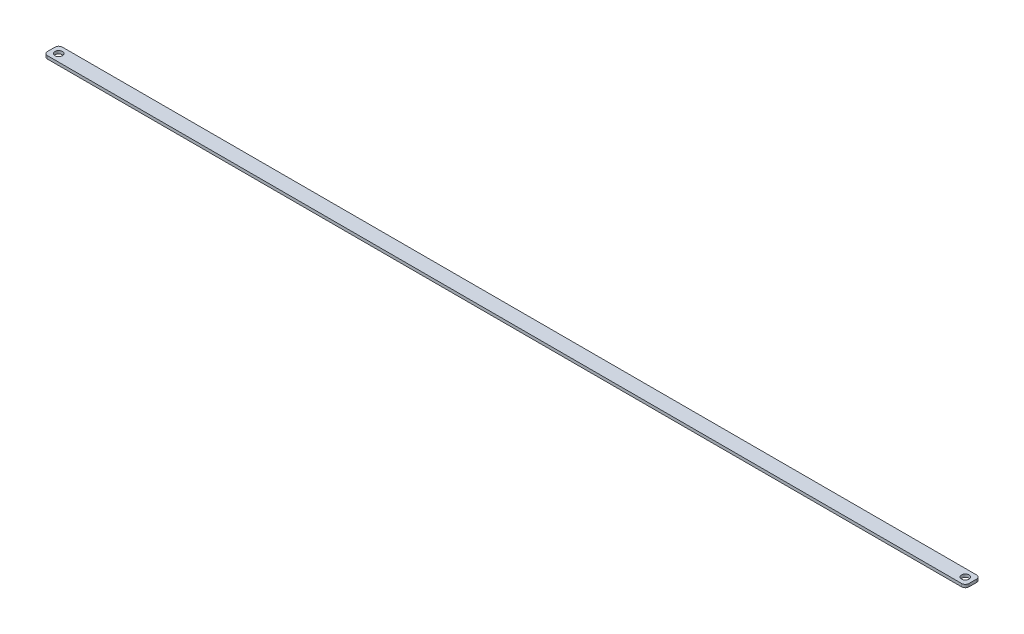
ISO-10303-21;
HEADER;
FILE_DESCRIPTION(('STEP AP214'),'2;1');
FILE_NAME('part.step','',(''),(''),'','','');
FILE_SCHEMA(('AUTOMOTIVE_DESIGN { 1 0 10303 214 1 1 1 1 }'));
ENDSEC;
DATA;
#1=APPLICATION_CONTEXT('core data for automotive mechanical design processes');
#2=APPLICATION_PROTOCOL_DEFINITION('international standard','automotive_design',2000,#1);
#3=PRODUCT_CONTEXT('',#1,'mechanical');
#4=PRODUCT('Part','Part','',(#3));
#5=PRODUCT_RELATED_PRODUCT_CATEGORY('part','',(#4));
#6=PRODUCT_DEFINITION_FORMATION('','',#4);
#7=PRODUCT_DEFINITION_CONTEXT('part definition',#1,'design');
#8=PRODUCT_DEFINITION('design','',#6,#7);
#9=PRODUCT_DEFINITION_SHAPE('','',#8);
#10=(LENGTH_UNIT() NAMED_UNIT(*) SI_UNIT(.MILLI.,.METRE.));
#11=(NAMED_UNIT(*) PLANE_ANGLE_UNIT() SI_UNIT($,.RADIAN.));
#12=(NAMED_UNIT(*) SI_UNIT($,.STERADIAN.) SOLID_ANGLE_UNIT());
#13=UNCERTAINTY_MEASURE_WITH_UNIT(LENGTH_MEASURE(1.E-05),#10,'distance_accuracy_value','');
#14=(GEOMETRIC_REPRESENTATION_CONTEXT(3) GLOBAL_UNCERTAINTY_ASSIGNED_CONTEXT((#13)) GLOBAL_UNIT_ASSIGNED_CONTEXT((#10,
#11,#12)) REPRESENTATION_CONTEXT('',''));
#15=CARTESIAN_POINT('',(0.,0.,0.));
#16=DIRECTION('',(0.,0.,1.));
#17=DIRECTION('',(1.,0.,0.));
#18=AXIS2_PLACEMENT_3D('',#15,#16,#17);
#19=CARTESIAN_POINT('',(336.370614307122,2.,-5.));
#20=DIRECTION('',(0.,-1.,0.));
#21=DIRECTION('',(0.,0.,-1.));
#22=AXIS2_PLACEMENT_3D('',#19,#20,#21);
#23=CYLINDRICAL_SURFACE('',#22,2.5);
#24=CARTESIAN_POINT('',(336.370614307122,0.,-5.));
#25=DIRECTION('',(0.,1.,0.));
#26=DIRECTION('',(0.,0.,1.));
#27=AXIS2_PLACEMENT_3D('',#24,#25,#26);
#28=CIRCLE('',#27,2.5);
#29=CARTESIAN_POINT('',(336.370614307122,0.,-2.5));
#30=VERTEX_POINT('',#29);
#31=EDGE_CURVE('E220',#30,#30,#28,.T.);
#32=ORIENTED_EDGE('',*,*,#31,.F.);
#33=EDGE_LOOP('',(#32));
#34=FACE_BOUND('',#33,.T.);
#35=CARTESIAN_POINT('',(336.370614307122,2.,-5.));
#36=DIRECTION('',(0.,1.,0.));
#37=DIRECTION('',(0.,0.,1.));
#38=AXIS2_PLACEMENT_3D('',#35,#36,#37);
#39=CIRCLE('',#38,2.5);
#40=CARTESIAN_POINT('',(336.370614307122,2.,-2.5));
#41=VERTEX_POINT('',#40);
#42=EDGE_CURVE('E13',#41,#41,#39,.T.);
#43=ORIENTED_EDGE('',*,*,#42,.T.);
#44=EDGE_LOOP('',(#43));
#45=FACE_BOUND('',#44,.T.);
#46=ADVANCED_FACE('F93',(#34,#45),#23,.F.);
#47=CARTESIAN_POINT('',(-272.629385692878,2.,-5.));
#48=DIRECTION('',(0.,-1.,0.));
#49=DIRECTION('',(0.,0.,-1.));
#50=AXIS2_PLACEMENT_3D('',#47,#48,#49);
#51=CYLINDRICAL_SURFACE('',#50,2.5);
#52=CARTESIAN_POINT('',(-272.629385692878,0.,-5.));
#53=DIRECTION('',(0.,1.,0.));
#54=DIRECTION('',(0.,0.,1.));
#55=AXIS2_PLACEMENT_3D('',#52,#53,#54);
#56=CIRCLE('',#55,2.5);
#57=CARTESIAN_POINT('',(-272.629385692878,0.,-2.5));
#58=VERTEX_POINT('',#57);
#59=EDGE_CURVE('E233',#58,#58,#56,.T.);
#60=ORIENTED_EDGE('',*,*,#59,.F.);
#61=EDGE_LOOP('',(#60));
#62=FACE_BOUND('',#61,.T.);
#63=CARTESIAN_POINT('',(-272.629385692878,2.,-5.));
#64=DIRECTION('',(0.,1.,0.));
#65=DIRECTION('',(0.,0.,1.));
#66=AXIS2_PLACEMENT_3D('',#63,#64,#65);
#67=CIRCLE('',#66,2.5);
#68=CARTESIAN_POINT('',(-272.629385692878,2.,-2.5));
#69=VERTEX_POINT('',#68);
#70=EDGE_CURVE('E103',#69,#69,#67,.T.);
#71=ORIENTED_EDGE('',*,*,#70,.T.);
#72=EDGE_LOOP('',(#71));
#73=FACE_BOUND('',#72,.T.);
#74=ADVANCED_FACE('F254',(#62,#73),#51,.F.);
#75=CARTESIAN_POINT('',(47.5,2.,-2.5));
#76=DIRECTION('',(0.,1.,0.));
#77=DIRECTION('',(0.,0.,1.));
#78=AXIS2_PLACEMENT_3D('',#75,#76,#77);
#79=PLANE('',#78);
#80=DIRECTION('',(1.,0.,0.));
#81=VECTOR('',#80,1.);
#82=CARTESIAN_POINT('',(-275.129385692878,2.,0.));
#83=LINE('',#82,#81);
#84=CARTESIAN_POINT('',(-275.129385692878,2.,0.));
#85=VERTEX_POINT('',#84);
#86=CARTESIAN_POINT('',(338.870614307122,2.,0.));
#87=VERTEX_POINT('',#86);
#88=EDGE_CURVE('E156',#85,#87,#83,.T.);
#89=ORIENTED_EDGE('',*,*,#88,.T.);
#90=CARTESIAN_POINT('',(338.870614307122,2.,-2.5));
#91=DIRECTION('',(0.,1.,0.));
#92=DIRECTION('',(0.,0.,1.));
#93=AXIS2_PLACEMENT_3D('',#90,#91,#92);
#94=CIRCLE('',#93,2.5);
#95=CARTESIAN_POINT('',(341.370614307122,2.,-2.50000000000002));
#96=VERTEX_POINT('',#95);
#97=EDGE_CURVE('E162',#87,#96,#94,.T.);
#98=ORIENTED_EDGE('',*,*,#97,.T.);
#99=DIRECTION('',(0.,0.,-1.));
#100=VECTOR('',#99,1.);
#101=CARTESIAN_POINT('',(341.370614307122,2.,-2.50000000000002));
#102=LINE('',#101,#100);
#103=CARTESIAN_POINT('',(341.370614307122,2.,-7.49999999999998));
#104=VERTEX_POINT('',#103);
#105=EDGE_CURVE('E184',#96,#104,#102,.T.);
#106=ORIENTED_EDGE('',*,*,#105,.T.);
#107=CARTESIAN_POINT('',(338.870614307122,2.,-7.5));
#108=DIRECTION('',(0.,1.,0.));
#109=DIRECTION('',(0.,0.,-1.));
#110=AXIS2_PLACEMENT_3D('',#107,#108,#109);
#111=CIRCLE('',#110,2.5);
#112=CARTESIAN_POINT('',(338.870614307122,2.,-10.));
#113=VERTEX_POINT('',#112);
#114=EDGE_CURVE('E188',#104,#113,#111,.T.);
#115=ORIENTED_EDGE('',*,*,#114,.T.);
#116=DIRECTION('',(-1.,0.,0.));
#117=VECTOR('',#116,1.);
#118=CARTESIAN_POINT('',(293.870614307122,2.,-10.));
#119=LINE('',#118,#117);
#120=CARTESIAN_POINT('',(-275.129385692878,2.,-10.));
#121=VERTEX_POINT('',#120);
#122=EDGE_CURVE('E242',#113,#121,#119,.T.);
#123=ORIENTED_EDGE('',*,*,#122,.T.);
#124=CARTESIAN_POINT('',(-275.129385692878,2.,-7.5));
#125=DIRECTION('',(0.,1.,0.));
#126=DIRECTION('',(0.,0.,-1.));
#127=AXIS2_PLACEMENT_3D('',#124,#125,#126);
#128=CIRCLE('',#127,2.5);
#129=CARTESIAN_POINT('',(-277.629385692878,2.,-7.49999999999998));
#130=VERTEX_POINT('',#129);
#131=EDGE_CURVE('E168',#121,#130,#128,.T.);
#132=ORIENTED_EDGE('',*,*,#131,.T.);
#133=DIRECTION('',(0.,0.,1.));
#134=VECTOR('',#133,1.);
#135=CARTESIAN_POINT('',(-277.629385692878,2.,-2.50000000000002));
#136=LINE('',#135,#134);
#137=CARTESIAN_POINT('',(-277.629385692878,2.,-2.50000000000002));
#138=VERTEX_POINT('',#137);
#139=EDGE_CURVE('E186',#130,#138,#136,.T.);
#140=ORIENTED_EDGE('',*,*,#139,.T.);
#141=CARTESIAN_POINT('',(-275.129385692878,2.,-2.5));
#142=DIRECTION('',(0.,1.,0.));
#143=DIRECTION('',(0.,0.,-1.));
#144=AXIS2_PLACEMENT_3D('',#141,#142,#143);
#145=CIRCLE('',#144,2.5);
#146=EDGE_CURVE('E165',#138,#85,#145,.T.);
#147=ORIENTED_EDGE('',*,*,#146,.T.);
#148=EDGE_LOOP('',(#89,#98,#106,#115,#123,#132,#140,#147));
#149=FACE_BOUND('',#148,.T.);
#150=ORIENTED_EDGE('',*,*,#42,.F.);
#151=EDGE_LOOP('',(#150));
#152=FACE_BOUND('',#151,.T.);
#153=ORIENTED_EDGE('',*,*,#70,.F.);
#154=EDGE_LOOP('',(#153));
#155=FACE_BOUND('',#154,.T.);
#156=ADVANCED_FACE('F158',(#149,#152,#155),#79,.T.);
#157=CARTESIAN_POINT('',(338.870614307122,0.,-2.5));
#158=DIRECTION('',(0.,1.,0.));
#159=DIRECTION('',(0.,0.,1.));
#160=AXIS2_PLACEMENT_3D('',#157,#158,#159);
#161=PLANE('',#160);
#162=ORIENTED_EDGE('',*,*,#31,.T.);
#163=EDGE_LOOP('',(#162));
#164=FACE_BOUND('',#163,.T.);
#165=CARTESIAN_POINT('',(338.870614307122,0.,-2.5));
#166=DIRECTION('',(0.,1.,0.));
#167=DIRECTION('',(0.,0.,1.));
#168=AXIS2_PLACEMENT_3D('',#165,#166,#167);
#169=CIRCLE('',#168,2.5);
#170=CARTESIAN_POINT('',(338.870614307122,0.,0.));
#171=VERTEX_POINT('',#170);
#172=CARTESIAN_POINT('',(341.370614307122,0.,-2.50000000000002));
#173=VERTEX_POINT('',#172);
#174=EDGE_CURVE('E177',#171,#173,#169,.T.);
#175=ORIENTED_EDGE('',*,*,#174,.F.);
#176=DIRECTION('',(1.,0.,0.));
#177=VECTOR('',#176,1.);
#178=CARTESIAN_POINT('',(-275.129385692878,0.,0.));
#179=LINE('',#178,#177);
#180=CARTESIAN_POINT('',(-275.129385692878,0.,0.));
#181=VERTEX_POINT('',#180);
#182=EDGE_CURVE('E173',#181,#171,#179,.T.);
#183=ORIENTED_EDGE('',*,*,#182,.F.);
#184=CARTESIAN_POINT('',(-275.129385692878,0.,-2.5));
#185=DIRECTION('',(0.,1.,0.));
#186=DIRECTION('',(0.,0.,-1.));
#187=AXIS2_PLACEMENT_3D('',#184,#185,#186);
#188=CIRCLE('',#187,2.5);
#189=CARTESIAN_POINT('',(-277.629385692878,0.,-2.50000000000002));
#190=VERTEX_POINT('',#189);
#191=EDGE_CURVE('E199',#190,#181,#188,.T.);
#192=ORIENTED_EDGE('',*,*,#191,.F.);
#193=DIRECTION('',(0.,0.,1.));
#194=VECTOR('',#193,1.);
#195=CARTESIAN_POINT('',(-277.629385692878,0.,-2.50000000000002));
#196=LINE('',#195,#194);
#197=CARTESIAN_POINT('',(-277.629385692878,0.,-7.49999999999998));
#198=VERTEX_POINT('',#197);
#199=EDGE_CURVE('E206',#198,#190,#196,.T.);
#200=ORIENTED_EDGE('',*,*,#199,.F.);
#201=CARTESIAN_POINT('',(-275.129385692878,0.,-7.5));
#202=DIRECTION('',(0.,1.,0.));
#203=DIRECTION('',(0.,0.,-1.));
#204=AXIS2_PLACEMENT_3D('',#201,#202,#203);
#205=CIRCLE('',#204,2.5);
#206=CARTESIAN_POINT('',(-275.129385692878,0.,-10.));
#207=VERTEX_POINT('',#206);
#208=EDGE_CURVE('E212',#207,#198,#205,.T.);
#209=ORIENTED_EDGE('',*,*,#208,.F.);
#210=DIRECTION('',(-1.,0.,0.));
#211=VECTOR('',#210,1.);
#212=CARTESIAN_POINT('',(293.870614307122,0.,-10.));
#213=LINE('',#212,#211);
#214=CARTESIAN_POINT('',(338.870614307122,0.,-10.));
#215=VERTEX_POINT('',#214);
#216=EDGE_CURVE('E218',#215,#207,#213,.T.);
#217=ORIENTED_EDGE('',*,*,#216,.F.);
#218=CARTESIAN_POINT('',(338.870614307122,0.,-7.5));
#219=DIRECTION('',(0.,1.,0.));
#220=DIRECTION('',(0.,0.,-1.));
#221=AXIS2_PLACEMENT_3D('',#218,#219,#220);
#222=CIRCLE('',#221,2.5);
#223=CARTESIAN_POINT('',(341.370614307122,0.,-7.49999999999998));
#224=VERTEX_POINT('',#223);
#225=EDGE_CURVE('E223',#224,#215,#222,.T.);
#226=ORIENTED_EDGE('',*,*,#225,.F.);
#227=DIRECTION('',(0.,0.,-1.));
#228=VECTOR('',#227,1.);
#229=CARTESIAN_POINT('',(341.370614307122,0.,-2.50000000000002));
#230=LINE('',#229,#228);
#231=EDGE_CURVE('E178',#173,#224,#230,.T.);
#232=ORIENTED_EDGE('',*,*,#231,.F.);
#233=EDGE_LOOP('',(#175,#183,#192,#200,#209,#217,#226,#232));
#234=FACE_BOUND('',#233,.T.);
#235=ORIENTED_EDGE('',*,*,#59,.T.);
#236=EDGE_LOOP('',(#235));
#237=FACE_BOUND('',#236,.T.);
#238=ADVANCED_FACE('F249',(#164,#234,#237),#161,.F.);
#239=CARTESIAN_POINT('',(293.870614307122,2.,-10.));
#240=DIRECTION('',(0.,0.,1.));
#241=DIRECTION('',(1.,0.,0.));
#242=AXIS2_PLACEMENT_3D('',#239,#240,#241);
#243=PLANE('',#242);
#244=ORIENTED_EDGE('',*,*,#216,.T.);
#245=DIRECTION('',(0.,-1.,0.));
#246=VECTOR('',#245,1.);
#247=CARTESIAN_POINT('',(-275.129385692878,2.,-10.));
#248=LINE('',#247,#246);
#249=EDGE_CURVE('E209',#121,#207,#248,.T.);
#250=ORIENTED_EDGE('',*,*,#249,.F.);
#251=ORIENTED_EDGE('',*,*,#122,.F.);
#252=DIRECTION('',(0.,-1.,0.));
#253=VECTOR('',#252,1.);
#254=CARTESIAN_POINT('',(338.870614307122,2.,-10.));
#255=LINE('',#254,#253);
#256=EDGE_CURVE('E112',#113,#215,#255,.T.);
#257=ORIENTED_EDGE('',*,*,#256,.T.);
#258=EDGE_LOOP('',(#244,#250,#251,#257));
#259=FACE_BOUND('',#258,.T.);
#260=ADVANCED_FACE('F271',(#259),#243,.F.);
#261=CARTESIAN_POINT('',(293.870614307122,2.,0.));
#262=DIRECTION('',(0.,0.,-1.));
#263=DIRECTION('',(-1.,0.,0.));
#264=AXIS2_PLACEMENT_3D('',#261,#262,#263);
#265=PLANE('',#264);
#266=DIRECTION('',(0.,-1.,0.));
#267=VECTOR('',#266,1.);
#268=CARTESIAN_POINT('',(338.870614307122,2.,0.));
#269=LINE('',#268,#267);
#270=EDGE_CURVE('E171',#87,#171,#269,.T.);
#271=ORIENTED_EDGE('',*,*,#270,.F.);
#272=ORIENTED_EDGE('',*,*,#88,.F.);
#273=DIRECTION('',(0.,-1.,0.));
#274=VECTOR('',#273,1.);
#275=CARTESIAN_POINT('',(-275.129385692878,2.,0.));
#276=LINE('',#275,#274);
#277=EDGE_CURVE('E196',#85,#181,#276,.T.);
#278=ORIENTED_EDGE('',*,*,#277,.T.);
#279=ORIENTED_EDGE('',*,*,#182,.T.);
#280=EDGE_LOOP('',(#271,#272,#278,#279));
#281=FACE_BOUND('',#280,.T.);
#282=ADVANCED_FACE('F172',(#281),#265,.F.);
#283=CARTESIAN_POINT('',(338.870614307122,2.,-2.5));
#284=DIRECTION('',(0.,-1.,0.));
#285=DIRECTION('',(0.,0.,-1.));
#286=AXIS2_PLACEMENT_3D('',#283,#284,#285);
#287=CYLINDRICAL_SURFACE('',#286,2.5);
#288=ORIENTED_EDGE('',*,*,#174,.T.);
#289=DIRECTION('',(0.,-1.,0.));
#290=VECTOR('',#289,1.);
#291=CARTESIAN_POINT('',(341.370614307122,2.,-2.50000000000002));
#292=LINE('',#291,#290);
#293=EDGE_CURVE('E182',#96,#173,#292,.T.);
#294=ORIENTED_EDGE('',*,*,#293,.F.);
#295=ORIENTED_EDGE('',*,*,#97,.F.);
#296=ORIENTED_EDGE('',*,*,#270,.T.);
#297=EDGE_LOOP('',(#288,#294,#295,#296));
#298=FACE_BOUND('',#297,.T.);
#299=ADVANCED_FACE('F180',(#298),#287,.T.);
#300=CARTESIAN_POINT('',(341.370614307122,2.,-2.50000000000002));
#301=DIRECTION('',(-1.,0.,0.));
#302=DIRECTION('',(0.,0.,1.));
#303=AXIS2_PLACEMENT_3D('',#300,#301,#302);
#304=PLANE('',#303);
#305=ORIENTED_EDGE('',*,*,#231,.T.);
#306=DIRECTION('',(0.,-1.,0.));
#307=VECTOR('',#306,1.);
#308=CARTESIAN_POINT('',(341.370614307122,2.,-7.49999999999998));
#309=LINE('',#308,#307);
#310=EDGE_CURVE('E215',#104,#224,#309,.T.);
#311=ORIENTED_EDGE('',*,*,#310,.F.);
#312=ORIENTED_EDGE('',*,*,#105,.F.);
#313=ORIENTED_EDGE('',*,*,#293,.T.);
#314=EDGE_LOOP('',(#305,#311,#312,#313));
#315=FACE_BOUND('',#314,.T.);
#316=ADVANCED_FACE('F278',(#315),#304,.F.);
#317=CARTESIAN_POINT('',(338.870614307122,2.,-7.5));
#318=DIRECTION('',(0.,-1.,0.));
#319=DIRECTION('',(0.,0.,-1.));
#320=AXIS2_PLACEMENT_3D('',#317,#318,#319);
#321=CYLINDRICAL_SURFACE('',#320,2.5);
#322=ORIENTED_EDGE('',*,*,#225,.T.);
#323=ORIENTED_EDGE('',*,*,#256,.F.);
#324=ORIENTED_EDGE('',*,*,#114,.F.);
#325=ORIENTED_EDGE('',*,*,#310,.T.);
#326=EDGE_LOOP('',(#322,#323,#324,#325));
#327=FACE_BOUND('',#326,.T.);
#328=ADVANCED_FACE('F281',(#327),#321,.T.);
#329=CARTESIAN_POINT('',(-275.129385692878,2.,-7.5));
#330=DIRECTION('',(0.,-1.,0.));
#331=DIRECTION('',(0.,0.,-1.));
#332=AXIS2_PLACEMENT_3D('',#329,#330,#331);
#333=CYLINDRICAL_SURFACE('',#332,2.5);
#334=ORIENTED_EDGE('',*,*,#208,.T.);
#335=DIRECTION('',(0.,-1.,0.));
#336=VECTOR('',#335,1.);
#337=CARTESIAN_POINT('',(-277.629385692878,2.,-7.49999999999998));
#338=LINE('',#337,#336);
#339=EDGE_CURVE('E202',#130,#198,#338,.T.);
#340=ORIENTED_EDGE('',*,*,#339,.F.);
#341=ORIENTED_EDGE('',*,*,#131,.F.);
#342=ORIENTED_EDGE('',*,*,#249,.T.);
#343=EDGE_LOOP('',(#334,#340,#341,#342));
#344=FACE_BOUND('',#343,.T.);
#345=ADVANCED_FACE('F285',(#344),#333,.T.);
#346=CARTESIAN_POINT('',(-277.629385692878,2.,-2.50000000000002));
#347=DIRECTION('',(1.,0.,0.));
#348=DIRECTION('',(0.,0.,-1.));
#349=AXIS2_PLACEMENT_3D('',#346,#347,#348);
#350=PLANE('',#349);
#351=ORIENTED_EDGE('',*,*,#199,.T.);
#352=DIRECTION('',(0.,-1.,0.));
#353=VECTOR('',#352,1.);
#354=CARTESIAN_POINT('',(-277.629385692878,2.,-2.50000000000002));
#355=LINE('',#354,#353);
#356=EDGE_CURVE('E203',#138,#190,#355,.T.);
#357=ORIENTED_EDGE('',*,*,#356,.F.);
#358=ORIENTED_EDGE('',*,*,#139,.F.);
#359=ORIENTED_EDGE('',*,*,#339,.T.);
#360=EDGE_LOOP('',(#351,#357,#358,#359));
#361=FACE_BOUND('',#360,.T.);
#362=ADVANCED_FACE('F288',(#361),#350,.F.);
#363=CARTESIAN_POINT('',(-275.129385692878,2.,-2.5));
#364=DIRECTION('',(0.,-1.,0.));
#365=DIRECTION('',(0.,0.,-1.));
#366=AXIS2_PLACEMENT_3D('',#363,#364,#365);
#367=CYLINDRICAL_SURFACE('',#366,2.5);
#368=ORIENTED_EDGE('',*,*,#191,.T.);
#369=ORIENTED_EDGE('',*,*,#277,.F.);
#370=ORIENTED_EDGE('',*,*,#146,.F.);
#371=ORIENTED_EDGE('',*,*,#356,.T.);
#372=EDGE_LOOP('',(#368,#369,#370,#371));
#373=FACE_BOUND('',#372,.T.);
#374=ADVANCED_FACE('F95',(#373),#367,.T.);
#375=CLOSED_SHELL('',(#46,#74,#156,#238,#260,#282,#299,#316,#328,#345,#362,#374));
#376=MANIFOLD_SOLID_BREP('B2',#375);
#377=ADVANCED_BREP_SHAPE_REPRESENTATION('',(#18,#376),#14);
#378=SHAPE_DEFINITION_REPRESENTATION(#9,#377);
ENDSEC;
END-ISO-10303-21;
